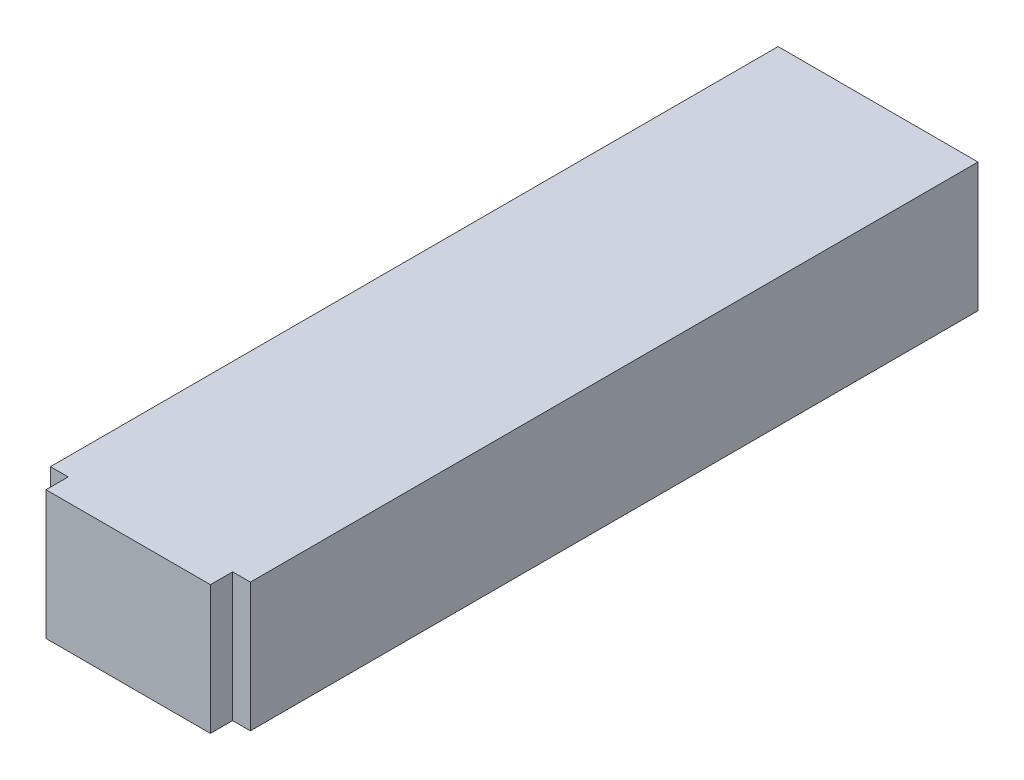
ISO-10303-21;
HEADER;
FILE_DESCRIPTION(('STEP AP214'),'2;1');
FILE_NAME('part.step','',(''),(''),'','','');
FILE_SCHEMA(('AUTOMOTIVE_DESIGN { 1 0 10303 214 1 1 1 1 }'));
ENDSEC;
DATA;
#1=APPLICATION_CONTEXT('core data for automotive mechanical design processes');
#2=APPLICATION_PROTOCOL_DEFINITION('international standard','automotive_design',2000,#1);
#3=PRODUCT_CONTEXT('',#1,'mechanical');
#4=PRODUCT('Part','Part','',(#3));
#5=PRODUCT_RELATED_PRODUCT_CATEGORY('part','',(#4));
#6=PRODUCT_DEFINITION_FORMATION('','',#4);
#7=PRODUCT_DEFINITION_CONTEXT('part definition',#1,'design');
#8=PRODUCT_DEFINITION('design','',#6,#7);
#9=PRODUCT_DEFINITION_SHAPE('','',#8);
#10=(LENGTH_UNIT() NAMED_UNIT(*) SI_UNIT(.MILLI.,.METRE.));
#11=(NAMED_UNIT(*) PLANE_ANGLE_UNIT() SI_UNIT($,.RADIAN.));
#12=(NAMED_UNIT(*) SI_UNIT($,.STERADIAN.) SOLID_ANGLE_UNIT());
#13=UNCERTAINTY_MEASURE_WITH_UNIT(LENGTH_MEASURE(1.E-05),#10,'distance_accuracy_value','');
#14=(GEOMETRIC_REPRESENTATION_CONTEXT(3) GLOBAL_UNCERTAINTY_ASSIGNED_CONTEXT((#13)) GLOBAL_UNIT_ASSIGNED_CONTEXT((#10,
#11,#12)) REPRESENTATION_CONTEXT('',''));
#15=CARTESIAN_POINT('',(0.,0.,0.));
#16=DIRECTION('',(0.,0.,1.));
#17=DIRECTION('',(1.,0.,0.));
#18=AXIS2_PLACEMENT_3D('',#15,#16,#17);
#19=CARTESIAN_POINT('',(-899.999999999985,-8145.87861331706,-400.0000000001));
#20=DIRECTION('',(-1.,0.,0.));
#21=DIRECTION('',(0.,0.,1.));
#22=AXIS2_PLACEMENT_3D('',#19,#20,#21);
#23=PLANE('',#22);
#24=DIRECTION('',(0.,0.,-1.));
#25=VECTOR('',#24,1.);
#26=CARTESIAN_POINT('',(-899.999999999985,-1160.,-400.0000000001));
#27=LINE('',#26,#25);
#28=CARTESIAN_POINT('',(-899.999999999984,-1160.,6150.00000000003));
#29=VERTEX_POINT('',#28);
#30=CARTESIAN_POINT('',(-899.999999999985,-1160.,-400.0000000001));
#31=VERTEX_POINT('',#30);
#32=EDGE_CURVE('E44',#29,#31,#27,.T.);
#33=ORIENTED_EDGE('',*,*,#32,.F.);
#34=DIRECTION('',(0.,1.,0.));
#35=VECTOR('',#34,1.);
#36=CARTESIAN_POINT('',(-899.999999999984,-8145.87861331706,6150.00000000003));
#37=LINE('',#36,#35);
#38=CARTESIAN_POINT('',(-899.999999999984,0.,6150.00000000003));
#39=VERTEX_POINT('',#38);
#40=EDGE_CURVE('E117',#29,#39,#37,.T.);
#41=ORIENTED_EDGE('',*,*,#40,.T.);
#42=DIRECTION('',(0.,0.,1.));
#43=VECTOR('',#42,1.);
#44=CARTESIAN_POINT('',(-899.999999999985,0.,-400.0000000001));
#45=LINE('',#44,#43);
#46=CARTESIAN_POINT('',(-899.999999999985,0.,-400.0000000001));
#47=VERTEX_POINT('',#46);
#48=EDGE_CURVE('E144',#47,#39,#45,.T.);
#49=ORIENTED_EDGE('',*,*,#48,.F.);
#50=DIRECTION('',(0.,1.,0.));
#51=VECTOR('',#50,1.);
#52=CARTESIAN_POINT('',(-899.999999999985,-8145.87861331706,-400.0000000001));
#53=LINE('',#52,#51);
#54=EDGE_CURVE('E104',#31,#47,#53,.T.);
#55=ORIENTED_EDGE('',*,*,#54,.F.);
#56=EDGE_LOOP('',(#33,#41,#49,#55));
#57=FACE_BOUND('',#56,.T.);
#58=ADVANCED_FACE('F37',(#57),#23,.T.);
#59=CARTESIAN_POINT('',(-899.999999999985,-8145.87861331706,-400.0000000001));
#60=DIRECTION('',(0.,0.,-1.));
#61=DIRECTION('',(-1.,0.,0.));
#62=AXIS2_PLACEMENT_3D('',#59,#60,#61);
#63=PLANE('',#62);
#64=DIRECTION('',(1.,0.,0.));
#65=VECTOR('',#64,1.);
#66=CARTESIAN_POINT('',(-899.999999999985,-1160.,-400.0000000001));
#67=LINE('',#66,#65);
#68=CARTESIAN_POINT('',(899.999999999764,-1160.,-400.0000000001));
#69=VERTEX_POINT('',#68);
#70=EDGE_CURVE('E81',#31,#69,#67,.T.);
#71=ORIENTED_EDGE('',*,*,#70,.F.);
#72=ORIENTED_EDGE('',*,*,#54,.T.);
#73=DIRECTION('',(-1.,0.,0.));
#74=VECTOR('',#73,1.);
#75=CARTESIAN_POINT('',(-899.999999999985,0.,-400.0000000001));
#76=LINE('',#75,#74);
#77=CARTESIAN_POINT('',(899.999999999764,0.,-400.0000000001));
#78=VERTEX_POINT('',#77);
#79=EDGE_CURVE('E119',#78,#47,#76,.T.);
#80=ORIENTED_EDGE('',*,*,#79,.F.);
#81=DIRECTION('',(0.,1.,0.));
#82=VECTOR('',#81,1.);
#83=CARTESIAN_POINT('',(899.999999999764,-8145.87861331706,-400.0000000001));
#84=LINE('',#83,#82);
#85=EDGE_CURVE('E102',#69,#78,#84,.T.);
#86=ORIENTED_EDGE('',*,*,#85,.F.);
#87=EDGE_LOOP('',(#71,#72,#80,#86));
#88=FACE_BOUND('',#87,.T.);
#89=ADVANCED_FACE('F169',(#88),#63,.T.);
#90=CARTESIAN_POINT('',(899.999999999764,-8145.87861331706,-400.0000000001));
#91=DIRECTION('',(1.,0.,0.));
#92=DIRECTION('',(0.,0.,-1.));
#93=AXIS2_PLACEMENT_3D('',#90,#91,#92);
#94=PLANE('',#93);
#95=DIRECTION('',(0.,0.,1.));
#96=VECTOR('',#95,1.);
#97=CARTESIAN_POINT('',(899.999999999764,-1160.,-400.0000000001));
#98=LINE('',#97,#96);
#99=CARTESIAN_POINT('',(899.999999999771,-1160.,6150.00000000003));
#100=VERTEX_POINT('',#99);
#101=EDGE_CURVE('E77',#69,#100,#98,.T.);
#102=ORIENTED_EDGE('',*,*,#101,.F.);
#103=ORIENTED_EDGE('',*,*,#85,.T.);
#104=DIRECTION('',(0.,0.,-1.));
#105=VECTOR('',#104,1.);
#106=CARTESIAN_POINT('',(899.999999999764,0.,-400.0000000001));
#107=LINE('',#106,#105);
#108=CARTESIAN_POINT('',(899.999999999771,0.,6150.00000000003));
#109=VERTEX_POINT('',#108);
#110=EDGE_CURVE('E100',#109,#78,#107,.T.);
#111=ORIENTED_EDGE('',*,*,#110,.F.);
#112=DIRECTION('',(0.,1.,0.));
#113=VECTOR('',#112,1.);
#114=CARTESIAN_POINT('',(899.999999999771,-8145.87861331706,6150.00000000003));
#115=LINE('',#114,#113);
#116=EDGE_CURVE('E93',#100,#109,#115,.T.);
#117=ORIENTED_EDGE('',*,*,#116,.F.);
#118=EDGE_LOOP('',(#102,#103,#111,#117));
#119=FACE_BOUND('',#118,.T.);
#120=ADVANCED_FACE('F98',(#119),#94,.T.);
#121=CARTESIAN_POINT('',(740.,-8145.87861331706,6150.00000000002));
#122=DIRECTION('',(0.,0.,1.));
#123=DIRECTION('',(1.,0.,0.));
#124=AXIS2_PLACEMENT_3D('',#121,#122,#123);
#125=PLANE('',#124);
#126=DIRECTION('',(-1.,0.,0.));
#127=VECTOR('',#126,1.);
#128=CARTESIAN_POINT('',(740.,-1160.,6150.00000000002));
#129=LINE('',#128,#127);
#130=CARTESIAN_POINT('',(740.,-1160.,6150.00000000002));
#131=VERTEX_POINT('',#130);
#132=EDGE_CURVE('E80',#100,#131,#129,.T.);
#133=ORIENTED_EDGE('',*,*,#132,.F.);
#134=ORIENTED_EDGE('',*,*,#116,.T.);
#135=DIRECTION('',(1.,0.,0.));
#136=VECTOR('',#135,1.);
#137=CARTESIAN_POINT('',(740.,0.,6150.00000000002));
#138=LINE('',#137,#136);
#139=CARTESIAN_POINT('',(740.,0.,6150.00000000002));
#140=VERTEX_POINT('',#139);
#141=EDGE_CURVE('E130',#140,#109,#138,.T.);
#142=ORIENTED_EDGE('',*,*,#141,.F.);
#143=DIRECTION('',(0.,1.,0.));
#144=VECTOR('',#143,1.);
#145=CARTESIAN_POINT('',(740.,-8145.87861331706,6150.00000000002));
#146=LINE('',#145,#144);
#147=EDGE_CURVE('E96',#131,#140,#146,.T.);
#148=ORIENTED_EDGE('',*,*,#147,.F.);
#149=EDGE_LOOP('',(#133,#134,#142,#148));
#150=FACE_BOUND('',#149,.T.);
#151=ADVANCED_FACE('F90',(#150),#125,.T.);
#152=CARTESIAN_POINT('',(740.,-8145.87861331706,6350.00000000002));
#153=DIRECTION('',(1.,0.,0.));
#154=DIRECTION('',(0.,0.,-1.));
#155=AXIS2_PLACEMENT_3D('',#152,#153,#154);
#156=PLANE('',#155);
#157=DIRECTION('',(0.,0.,1.));
#158=VECTOR('',#157,1.);
#159=CARTESIAN_POINT('',(740.,-1160.,6350.00000000002));
#160=LINE('',#159,#158);
#161=CARTESIAN_POINT('',(740.,-1160.,6350.00000000002));
#162=VERTEX_POINT('',#161);
#163=EDGE_CURVE('E57',#131,#162,#160,.T.);
#164=ORIENTED_EDGE('',*,*,#163,.F.);
#165=ORIENTED_EDGE('',*,*,#147,.T.);
#166=DIRECTION('',(0.,0.,-1.));
#167=VECTOR('',#166,1.);
#168=CARTESIAN_POINT('',(740.,0.,6350.00000000002));
#169=LINE('',#168,#167);
#170=CARTESIAN_POINT('',(740.,0.,6350.00000000002));
#171=VERTEX_POINT('',#170);
#172=EDGE_CURVE('E155',#171,#140,#169,.T.);
#173=ORIENTED_EDGE('',*,*,#172,.F.);
#174=DIRECTION('',(0.,1.,0.));
#175=VECTOR('',#174,1.);
#176=CARTESIAN_POINT('',(740.,-8145.87861331706,6350.00000000002));
#177=LINE('',#176,#175);
#178=EDGE_CURVE('E106',#162,#171,#177,.T.);
#179=ORIENTED_EDGE('',*,*,#178,.F.);
#180=EDGE_LOOP('',(#164,#165,#173,#179));
#181=FACE_BOUND('',#180,.T.);
#182=ADVANCED_FACE('F181',(#181),#156,.T.);
#183=CARTESIAN_POINT('',(-740.,-8145.87861331706,6350.00000000002));
#184=DIRECTION('',(0.,0.,1.));
#185=DIRECTION('',(1.,0.,0.));
#186=AXIS2_PLACEMENT_3D('',#183,#184,#185);
#187=PLANE('',#186);
#188=DIRECTION('',(-1.,0.,0.));
#189=VECTOR('',#188,1.);
#190=CARTESIAN_POINT('',(-740.,-1160.,6350.00000000002));
#191=LINE('',#190,#189);
#192=CARTESIAN_POINT('',(-740.,-1160.,6350.00000000002));
#193=VERTEX_POINT('',#192);
#194=EDGE_CURVE('E51',#162,#193,#191,.T.);
#195=ORIENTED_EDGE('',*,*,#194,.F.);
#196=ORIENTED_EDGE('',*,*,#178,.T.);
#197=DIRECTION('',(1.,0.,0.));
#198=VECTOR('',#197,1.);
#199=CARTESIAN_POINT('',(-740.,0.,6350.00000000002));
#200=LINE('',#199,#198);
#201=CARTESIAN_POINT('',(-740.,0.,6350.00000000002));
#202=VERTEX_POINT('',#201);
#203=EDGE_CURVE('E152',#202,#171,#200,.T.);
#204=ORIENTED_EDGE('',*,*,#203,.F.);
#205=DIRECTION('',(0.,1.,0.));
#206=VECTOR('',#205,1.);
#207=CARTESIAN_POINT('',(-740.,-8145.87861331706,6350.00000000002));
#208=LINE('',#207,#206);
#209=EDGE_CURVE('E112',#193,#202,#208,.T.);
#210=ORIENTED_EDGE('',*,*,#209,.F.);
#211=EDGE_LOOP('',(#195,#196,#204,#210));
#212=FACE_BOUND('',#211,.T.);
#213=ADVANCED_FACE('F179',(#212),#187,.T.);
#214=CARTESIAN_POINT('',(-740.,-8145.87861331706,6150.00000000002));
#215=DIRECTION('',(-1.,0.,0.));
#216=DIRECTION('',(0.,0.,1.));
#217=AXIS2_PLACEMENT_3D('',#214,#215,#216);
#218=PLANE('',#217);
#219=DIRECTION('',(0.,0.,-1.));
#220=VECTOR('',#219,1.);
#221=CARTESIAN_POINT('',(-740.,-1160.,6150.00000000002));
#222=LINE('',#221,#220);
#223=CARTESIAN_POINT('',(-740.,-1160.,6150.00000000002));
#224=VERTEX_POINT('',#223);
#225=EDGE_CURVE('E134',#193,#224,#222,.T.);
#226=ORIENTED_EDGE('',*,*,#225,.F.);
#227=ORIENTED_EDGE('',*,*,#209,.T.);
#228=DIRECTION('',(0.,0.,1.));
#229=VECTOR('',#228,1.);
#230=CARTESIAN_POINT('',(-740.,0.,6150.00000000002));
#231=LINE('',#230,#229);
#232=CARTESIAN_POINT('',(-740.,0.,6150.00000000002));
#233=VERTEX_POINT('',#232);
#234=EDGE_CURVE('E149',#233,#202,#231,.T.);
#235=ORIENTED_EDGE('',*,*,#234,.F.);
#236=DIRECTION('',(0.,1.,0.));
#237=VECTOR('',#236,1.);
#238=CARTESIAN_POINT('',(-740.,-8145.87861331706,6150.00000000002));
#239=LINE('',#238,#237);
#240=EDGE_CURVE('E115',#224,#233,#239,.T.);
#241=ORIENTED_EDGE('',*,*,#240,.F.);
#242=EDGE_LOOP('',(#226,#227,#235,#241));
#243=FACE_BOUND('',#242,.T.);
#244=ADVANCED_FACE('F177',(#243),#218,.T.);
#245=CARTESIAN_POINT('',(-899.999999999984,-8145.87861331706,6150.00000000003));
#246=DIRECTION('',(0.,0.,1.));
#247=DIRECTION('',(1.,0.,0.));
#248=AXIS2_PLACEMENT_3D('',#245,#246,#247);
#249=PLANE('',#248);
#250=DIRECTION('',(-1.,0.,0.));
#251=VECTOR('',#250,1.);
#252=CARTESIAN_POINT('',(-899.999999999984,-1160.,6150.00000000003));
#253=LINE('',#252,#251);
#254=EDGE_CURVE('E11',#224,#29,#253,.T.);
#255=ORIENTED_EDGE('',*,*,#254,.F.);
#256=ORIENTED_EDGE('',*,*,#240,.T.);
#257=DIRECTION('',(1.,0.,0.));
#258=VECTOR('',#257,1.);
#259=CARTESIAN_POINT('',(-899.999999999984,0.,6150.00000000003));
#260=LINE('',#259,#258);
#261=EDGE_CURVE('E146',#39,#233,#260,.T.);
#262=ORIENTED_EDGE('',*,*,#261,.F.);
#263=ORIENTED_EDGE('',*,*,#40,.F.);
#264=EDGE_LOOP('',(#255,#256,#262,#263));
#265=FACE_BOUND('',#264,.T.);
#266=ADVANCED_FACE('F203',(#265),#249,.T.);
#267=CARTESIAN_POINT('',(0.,0.,0.));
#268=DIRECTION('',(0.,1.,0.));
#269=DIRECTION('',(0.,0.,1.));
#270=AXIS2_PLACEMENT_3D('',#267,#268,#269);
#271=PLANE('',#270);
#272=ORIENTED_EDGE('',*,*,#48,.T.);
#273=ORIENTED_EDGE('',*,*,#261,.T.);
#274=ORIENTED_EDGE('',*,*,#234,.T.);
#275=ORIENTED_EDGE('',*,*,#203,.T.);
#276=ORIENTED_EDGE('',*,*,#172,.T.);
#277=ORIENTED_EDGE('',*,*,#141,.T.);
#278=ORIENTED_EDGE('',*,*,#110,.T.);
#279=ORIENTED_EDGE('',*,*,#79,.T.);
#280=EDGE_LOOP('',(#272,#273,#274,#275,#276,#277,#278,#279));
#281=FACE_BOUND('',#280,.T.);
#282=ADVANCED_FACE('F157',(#281),#271,.T.);
#283=CARTESIAN_POINT('',(0.,-1160.,-399.999999999966));
#284=DIRECTION('',(0.,1.,0.));
#285=DIRECTION('',(0.,0.,1.));
#286=AXIS2_PLACEMENT_3D('',#283,#284,#285);
#287=PLANE('',#286);
#288=ORIENTED_EDGE('',*,*,#32,.T.);
#289=ORIENTED_EDGE('',*,*,#70,.T.);
#290=ORIENTED_EDGE('',*,*,#101,.T.);
#291=ORIENTED_EDGE('',*,*,#132,.T.);
#292=ORIENTED_EDGE('',*,*,#163,.T.);
#293=ORIENTED_EDGE('',*,*,#194,.T.);
#294=ORIENTED_EDGE('',*,*,#225,.T.);
#295=ORIENTED_EDGE('',*,*,#254,.T.);
#296=EDGE_LOOP('',(#288,#289,#290,#291,#292,#293,#294,#295));
#297=FACE_BOUND('',#296,.T.);
#298=ADVANCED_FACE('F79',(#297),#287,.F.);
#299=CLOSED_SHELL('',(#58,#89,#120,#151,#182,#213,#244,#266,#282,#298));
#300=MANIFOLD_SOLID_BREP('B2',#299);
#301=ADVANCED_BREP_SHAPE_REPRESENTATION('',(#18,#300),#14);
#302=SHAPE_DEFINITION_REPRESENTATION(#9,#301);
ENDSEC;
END-ISO-10303-21;
